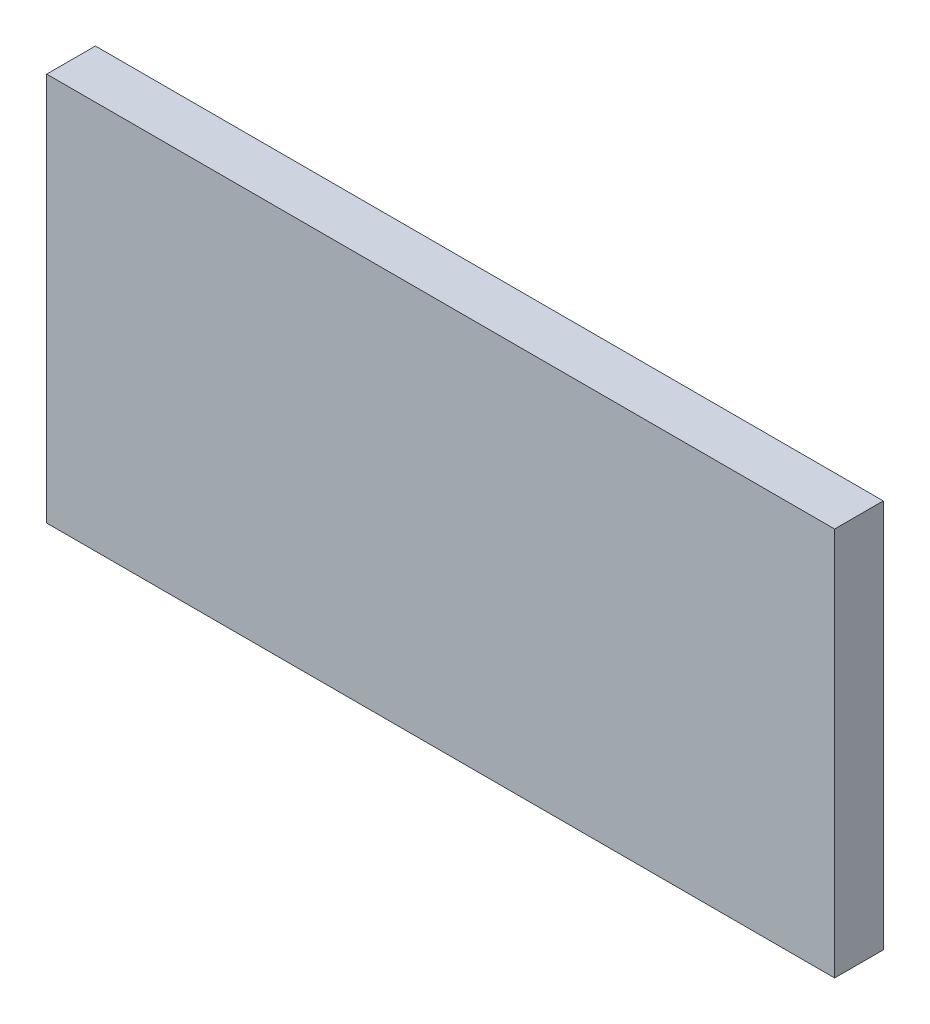
ISO-10303-21;
HEADER;
FILE_DESCRIPTION(('STEP AP214'),'2;1');
FILE_NAME('part.step','',(''),(''),'','','');
FILE_SCHEMA(('AUTOMOTIVE_DESIGN { 1 0 10303 214 1 1 1 1 }'));
ENDSEC;
DATA;
#1=APPLICATION_CONTEXT('core data for automotive mechanical design processes');
#2=APPLICATION_PROTOCOL_DEFINITION('international standard','automotive_design',2000,#1);
#3=PRODUCT_CONTEXT('',#1,'mechanical');
#4=PRODUCT('Part','Part','',(#3));
#5=PRODUCT_RELATED_PRODUCT_CATEGORY('part','',(#4));
#6=PRODUCT_DEFINITION_FORMATION('','',#4);
#7=PRODUCT_DEFINITION_CONTEXT('part definition',#1,'design');
#8=PRODUCT_DEFINITION('design','',#6,#7);
#9=PRODUCT_DEFINITION_SHAPE('','',#8);
#10=(LENGTH_UNIT() NAMED_UNIT(*) SI_UNIT(.MILLI.,.METRE.));
#11=(NAMED_UNIT(*) PLANE_ANGLE_UNIT() SI_UNIT($,.RADIAN.));
#12=(NAMED_UNIT(*) SI_UNIT($,.STERADIAN.) SOLID_ANGLE_UNIT());
#13=UNCERTAINTY_MEASURE_WITH_UNIT(LENGTH_MEASURE(1.E-05),#10,'distance_accuracy_value','');
#14=(GEOMETRIC_REPRESENTATION_CONTEXT(3) GLOBAL_UNCERTAINTY_ASSIGNED_CONTEXT((#13)) GLOBAL_UNIT_ASSIGNED_CONTEXT((#10,
#11,#12)) REPRESENTATION_CONTEXT('',''));
#15=CARTESIAN_POINT('',(0.,0.,0.));
#16=DIRECTION('',(0.,0.,1.));
#17=DIRECTION('',(1.,0.,0.));
#18=AXIS2_PLACEMENT_3D('',#15,#16,#17);
#19=CARTESIAN_POINT('',(106.627640398524,-38.3527346393683,-293.233340188379));
#20=DIRECTION('',(0.,1.,0.));
#21=DIRECTION('',(0.,0.,1.));
#22=AXIS2_PLACEMENT_3D('',#19,#20,#21);
#23=PLANE('',#22);
#24=DIRECTION('',(1.,0.,0.));
#25=VECTOR('',#24,1.);
#26=CARTESIAN_POINT('',(106.627640398524,-38.3527346393683,-312.283340188379));
#27=LINE('',#26,#25);
#28=CARTESIAN_POINT('',(106.627640398524,-38.3527346393683,-312.283340188379));
#29=VERTEX_POINT('',#28);
#30=CARTESIAN_POINT('',(415.033418153038,-38.3527346393683,-312.283340188379));
#31=VERTEX_POINT('',#30);
#32=EDGE_CURVE('E100',#29,#31,#27,.T.);
#33=ORIENTED_EDGE('',*,*,#32,.T.);
#34=DIRECTION('',(0.,0.,-1.));
#35=VECTOR('',#34,1.);
#36=CARTESIAN_POINT('',(415.033418153038,-38.3527346393683,-293.233340188379));
#37=LINE('',#36,#35);
#38=CARTESIAN_POINT('',(415.033418153038,-38.3527346393683,-293.233340188379));
#39=VERTEX_POINT('',#38);
#40=EDGE_CURVE('E11',#39,#31,#37,.T.);
#41=ORIENTED_EDGE('',*,*,#40,.F.);
#42=DIRECTION('',(1.,0.,0.));
#43=VECTOR('',#42,1.);
#44=CARTESIAN_POINT('',(106.627640398524,-38.3527346393683,-293.233340188379));
#45=LINE('',#44,#43);
#46=CARTESIAN_POINT('',(106.627640398524,-38.3527346393683,-293.233340188379));
#47=VERTEX_POINT('',#46);
#48=EDGE_CURVE('E88',#47,#39,#45,.T.);
#49=ORIENTED_EDGE('',*,*,#48,.F.);
#50=DIRECTION('',(0.,0.,-1.));
#51=VECTOR('',#50,1.);
#52=CARTESIAN_POINT('',(106.627640398524,-38.3527346393683,-293.233340188379));
#53=LINE('',#52,#51);
#54=EDGE_CURVE('E96',#47,#29,#53,.T.);
#55=ORIENTED_EDGE('',*,*,#54,.T.);
#56=EDGE_LOOP('',(#33,#41,#49,#55));
#57=FACE_BOUND('',#56,.T.);
#58=ADVANCED_FACE('F37',(#57),#23,.F.);
#59=CARTESIAN_POINT('',(415.033418153038,113.85432318732,-293.233340188379));
#60=DIRECTION('',(-1.,0.,0.));
#61=DIRECTION('',(0.,0.,1.));
#62=AXIS2_PLACEMENT_3D('',#59,#60,#61);
#63=PLANE('',#62);
#64=DIRECTION('',(0.,1.,0.));
#65=VECTOR('',#64,1.);
#66=CARTESIAN_POINT('',(415.033418153038,113.85432318732,-312.283340188379));
#67=LINE('',#66,#65);
#68=CARTESIAN_POINT('',(415.033418153038,113.85432318732,-312.283340188379));
#69=VERTEX_POINT('',#68);
#70=EDGE_CURVE('E92',#31,#69,#67,.T.);
#71=ORIENTED_EDGE('',*,*,#70,.T.);
#72=DIRECTION('',(0.,0.,-1.));
#73=VECTOR('',#72,1.);
#74=CARTESIAN_POINT('',(415.033418153038,113.85432318732,-293.233340188379));
#75=LINE('',#74,#73);
#76=CARTESIAN_POINT('',(415.033418153038,113.85432318732,-293.233340188379));
#77=VERTEX_POINT('',#76);
#78=EDGE_CURVE('E45',#77,#69,#75,.T.);
#79=ORIENTED_EDGE('',*,*,#78,.F.);
#80=DIRECTION('',(0.,1.,0.));
#81=VECTOR('',#80,1.);
#82=CARTESIAN_POINT('',(415.033418153038,113.85432318732,-293.233340188379));
#83=LINE('',#82,#81);
#84=EDGE_CURVE('E83',#39,#77,#83,.T.);
#85=ORIENTED_EDGE('',*,*,#84,.F.);
#86=ORIENTED_EDGE('',*,*,#40,.T.);
#87=EDGE_LOOP('',(#71,#79,#85,#86));
#88=FACE_BOUND('',#87,.T.);
#89=ADVANCED_FACE('F91',(#88),#63,.F.);
#90=CARTESIAN_POINT('',(106.627640398524,113.85432318732,-293.233340188379));
#91=DIRECTION('',(0.,-1.,0.));
#92=DIRECTION('',(0.,0.,-1.));
#93=AXIS2_PLACEMENT_3D('',#90,#91,#92);
#94=PLANE('',#93);
#95=DIRECTION('',(-1.,0.,0.));
#96=VECTOR('',#95,1.);
#97=CARTESIAN_POINT('',(106.627640398524,113.85432318732,-312.283340188379));
#98=LINE('',#97,#96);
#99=CARTESIAN_POINT('',(106.627640398524,113.85432318732,-312.283340188379));
#100=VERTEX_POINT('',#99);
#101=EDGE_CURVE('E70',#69,#100,#98,.T.);
#102=ORIENTED_EDGE('',*,*,#101,.T.);
#103=DIRECTION('',(0.,0.,-1.));
#104=VECTOR('',#103,1.);
#105=CARTESIAN_POINT('',(106.627640398524,113.85432318732,-293.233340188379));
#106=LINE('',#105,#104);
#107=CARTESIAN_POINT('',(106.627640398524,113.85432318732,-293.233340188379));
#108=VERTEX_POINT('',#107);
#109=EDGE_CURVE('E93',#108,#100,#106,.T.);
#110=ORIENTED_EDGE('',*,*,#109,.F.);
#111=DIRECTION('',(-1.,0.,0.));
#112=VECTOR('',#111,1.);
#113=CARTESIAN_POINT('',(106.627640398524,113.85432318732,-293.233340188379));
#114=LINE('',#113,#112);
#115=EDGE_CURVE('E86',#77,#108,#114,.T.);
#116=ORIENTED_EDGE('',*,*,#115,.F.);
#117=ORIENTED_EDGE('',*,*,#78,.T.);
#118=EDGE_LOOP('',(#102,#110,#116,#117));
#119=FACE_BOUND('',#118,.T.);
#120=ADVANCED_FACE('F94',(#119),#94,.F.);
#121=CARTESIAN_POINT('',(106.627640398524,113.85432318732,-293.233340188379));
#122=DIRECTION('',(1.,0.,0.));
#123=DIRECTION('',(0.,0.,-1.));
#124=AXIS2_PLACEMENT_3D('',#121,#122,#123);
#125=PLANE('',#124);
#126=DIRECTION('',(0.,-1.,0.));
#127=VECTOR('',#126,1.);
#128=CARTESIAN_POINT('',(106.627640398524,113.85432318732,-312.283340188379));
#129=LINE('',#128,#127);
#130=EDGE_CURVE('E76',#100,#29,#129,.T.);
#131=ORIENTED_EDGE('',*,*,#130,.T.);
#132=ORIENTED_EDGE('',*,*,#54,.F.);
#133=DIRECTION('',(0.,-1.,0.));
#134=VECTOR('',#133,1.);
#135=CARTESIAN_POINT('',(106.627640398524,113.85432318732,-293.233340188379));
#136=LINE('',#135,#134);
#137=EDGE_CURVE('E53',#108,#47,#136,.T.);
#138=ORIENTED_EDGE('',*,*,#137,.F.);
#139=ORIENTED_EDGE('',*,*,#109,.T.);
#140=EDGE_LOOP('',(#131,#132,#138,#139));
#141=FACE_BOUND('',#140,.T.);
#142=ADVANCED_FACE('F107',(#141),#125,.F.);
#143=CARTESIAN_POINT('',(0.,0.,-293.233340188379));
#144=DIRECTION('',(0.,0.,-1.));
#145=DIRECTION('',(-1.,0.,0.));
#146=AXIS2_PLACEMENT_3D('',#143,#144,#145);
#147=PLANE('',#146);
#148=ORIENTED_EDGE('',*,*,#48,.T.);
#149=ORIENTED_EDGE('',*,*,#84,.T.);
#150=ORIENTED_EDGE('',*,*,#115,.T.);
#151=ORIENTED_EDGE('',*,*,#137,.T.);
#152=EDGE_LOOP('',(#148,#149,#150,#151));
#153=FACE_BOUND('',#152,.T.);
#154=ADVANCED_FACE('F84',(#153),#147,.F.);
#155=CARTESIAN_POINT('',(0.,0.,-312.283340188379));
#156=DIRECTION('',(0.,0.,-1.));
#157=DIRECTION('',(-1.,0.,0.));
#158=AXIS2_PLACEMENT_3D('',#155,#156,#157);
#159=PLANE('',#158);
#160=ORIENTED_EDGE('',*,*,#32,.F.);
#161=ORIENTED_EDGE('',*,*,#130,.F.);
#162=ORIENTED_EDGE('',*,*,#101,.F.);
#163=ORIENTED_EDGE('',*,*,#70,.F.);
#164=EDGE_LOOP('',(#160,#161,#162,#163));
#165=FACE_BOUND('',#164,.T.);
#166=ADVANCED_FACE('F110',(#165),#159,.T.);
#167=CLOSED_SHELL('',(#58,#89,#120,#142,#154,#166));
#168=MANIFOLD_SOLID_BREP('B2',#167);
#169=ADVANCED_BREP_SHAPE_REPRESENTATION('',(#18,#168),#14);
#170=SHAPE_DEFINITION_REPRESENTATION(#9,#169);
ENDSEC;
END-ISO-10303-21;
